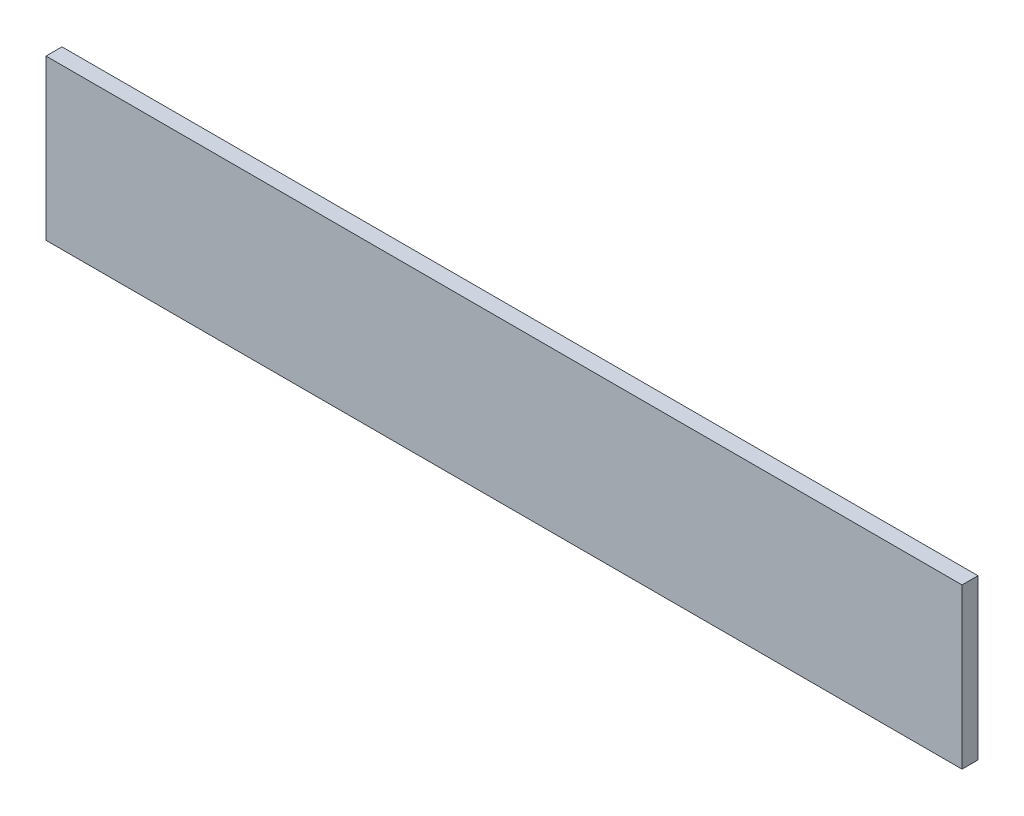
ISO-10303-21;
HEADER;
FILE_DESCRIPTION(('STEP AP214'),'2;1');
FILE_NAME('part.step','',(''),(''),'','','');
FILE_SCHEMA(('AUTOMOTIVE_DESIGN { 1 0 10303 214 1 1 1 1 }'));
ENDSEC;
DATA;
#1=APPLICATION_CONTEXT('core data for automotive mechanical design processes');
#2=APPLICATION_PROTOCOL_DEFINITION('international standard','automotive_design',2000,#1);
#3=PRODUCT_CONTEXT('',#1,'mechanical');
#4=PRODUCT('Part','Part','',(#3));
#5=PRODUCT_RELATED_PRODUCT_CATEGORY('part','',(#4));
#6=PRODUCT_DEFINITION_FORMATION('','',#4);
#7=PRODUCT_DEFINITION_CONTEXT('part definition',#1,'design');
#8=PRODUCT_DEFINITION('design','',#6,#7);
#9=PRODUCT_DEFINITION_SHAPE('','',#8);
#10=(LENGTH_UNIT() NAMED_UNIT(*) SI_UNIT(.MILLI.,.METRE.));
#11=(NAMED_UNIT(*) PLANE_ANGLE_UNIT() SI_UNIT($,.RADIAN.));
#12=(NAMED_UNIT(*) SI_UNIT($,.STERADIAN.) SOLID_ANGLE_UNIT());
#13=UNCERTAINTY_MEASURE_WITH_UNIT(LENGTH_MEASURE(1.E-05),#10,'distance_accuracy_value','');
#14=(GEOMETRIC_REPRESENTATION_CONTEXT(3) GLOBAL_UNCERTAINTY_ASSIGNED_CONTEXT((#13)) GLOBAL_UNIT_ASSIGNED_CONTEXT((#10,
#11,#12)) REPRESENTATION_CONTEXT('',''));
#15=CARTESIAN_POINT('',(0.,0.,0.));
#16=DIRECTION('',(0.,0.,1.));
#17=DIRECTION('',(1.,0.,0.));
#18=AXIS2_PLACEMENT_3D('',#15,#16,#17);
#19=CARTESIAN_POINT('',(-287.,50.,10.));
#20=DIRECTION('',(1.,0.,0.));
#21=DIRECTION('',(0.,0.,-1.));
#22=AXIS2_PLACEMENT_3D('',#19,#20,#21);
#23=PLANE('',#22);
#24=DIRECTION('',(0.,-1.,0.));
#25=VECTOR('',#24,1.);
#26=CARTESIAN_POINT('',(-287.,50.,0.));
#27=LINE('',#26,#25);
#28=CARTESIAN_POINT('',(-287.,50.,0.));
#29=VERTEX_POINT('',#28);
#30=CARTESIAN_POINT('',(-287.,-50.,0.));
#31=VERTEX_POINT('',#30);
#32=EDGE_CURVE('E102',#29,#31,#27,.T.);
#33=ORIENTED_EDGE('',*,*,#32,.T.);
#34=DIRECTION('',(0.,0.,-1.));
#35=VECTOR('',#34,1.);
#36=CARTESIAN_POINT('',(-287.,-50.,10.));
#37=LINE('',#36,#35);
#38=CARTESIAN_POINT('',(-287.,-50.,10.));
#39=VERTEX_POINT('',#38);
#40=EDGE_CURVE('E11',#39,#31,#37,.T.);
#41=ORIENTED_EDGE('',*,*,#40,.F.);
#42=DIRECTION('',(0.,-1.,0.));
#43=VECTOR('',#42,1.);
#44=CARTESIAN_POINT('',(-287.,50.,10.));
#45=LINE('',#44,#43);
#46=CARTESIAN_POINT('',(-287.,50.,10.));
#47=VERTEX_POINT('',#46);
#48=EDGE_CURVE('E90',#47,#39,#45,.T.);
#49=ORIENTED_EDGE('',*,*,#48,.F.);
#50=DIRECTION('',(0.,0.,-1.));
#51=VECTOR('',#50,1.);
#52=CARTESIAN_POINT('',(-287.,50.,10.));
#53=LINE('',#52,#51);
#54=EDGE_CURVE('E98',#47,#29,#53,.T.);
#55=ORIENTED_EDGE('',*,*,#54,.T.);
#56=EDGE_LOOP('',(#33,#41,#49,#55));
#57=FACE_BOUND('',#56,.T.);
#58=ADVANCED_FACE('F39',(#57),#23,.F.);
#59=CARTESIAN_POINT('',(-287.,-50.,10.));
#60=DIRECTION('',(0.,1.,0.));
#61=DIRECTION('',(-1.,0.,0.));
#62=AXIS2_PLACEMENT_3D('',#59,#60,#61);
#63=PLANE('',#62);
#64=DIRECTION('',(1.,0.,0.));
#65=VECTOR('',#64,1.);
#66=CARTESIAN_POINT('',(-287.,-50.,0.));
#67=LINE('',#66,#65);
#68=CARTESIAN_POINT('',(287.,-50.,0.));
#69=VERTEX_POINT('',#68);
#70=EDGE_CURVE('E94',#31,#69,#67,.T.);
#71=ORIENTED_EDGE('',*,*,#70,.T.);
#72=DIRECTION('',(0.,0.,-1.));
#73=VECTOR('',#72,1.);
#74=CARTESIAN_POINT('',(287.,-50.,10.));
#75=LINE('',#74,#73);
#76=CARTESIAN_POINT('',(287.,-50.,10.));
#77=VERTEX_POINT('',#76);
#78=EDGE_CURVE('E47',#77,#69,#75,.T.);
#79=ORIENTED_EDGE('',*,*,#78,.F.);
#80=DIRECTION('',(1.,0.,0.));
#81=VECTOR('',#80,1.);
#82=CARTESIAN_POINT('',(-287.,-50.,10.));
#83=LINE('',#82,#81);
#84=EDGE_CURVE('E85',#39,#77,#83,.T.);
#85=ORIENTED_EDGE('',*,*,#84,.F.);
#86=ORIENTED_EDGE('',*,*,#40,.T.);
#87=EDGE_LOOP('',(#71,#79,#85,#86));
#88=FACE_BOUND('',#87,.T.);
#89=ADVANCED_FACE('F93',(#88),#63,.F.);
#90=CARTESIAN_POINT('',(287.,50.,10.));
#91=DIRECTION('',(-1.,0.,0.));
#92=DIRECTION('',(0.,-1.,0.));
#93=AXIS2_PLACEMENT_3D('',#90,#91,#92);
#94=PLANE('',#93);
#95=DIRECTION('',(0.,1.,0.));
#96=VECTOR('',#95,1.);
#97=CARTESIAN_POINT('',(287.,50.,0.));
#98=LINE('',#97,#96);
#99=CARTESIAN_POINT('',(287.,50.,0.));
#100=VERTEX_POINT('',#99);
#101=EDGE_CURVE('E72',#69,#100,#98,.T.);
#102=ORIENTED_EDGE('',*,*,#101,.T.);
#103=DIRECTION('',(0.,0.,-1.));
#104=VECTOR('',#103,1.);
#105=CARTESIAN_POINT('',(287.,50.,10.));
#106=LINE('',#105,#104);
#107=CARTESIAN_POINT('',(287.,50.,10.));
#108=VERTEX_POINT('',#107);
#109=EDGE_CURVE('E95',#108,#100,#106,.T.);
#110=ORIENTED_EDGE('',*,*,#109,.F.);
#111=DIRECTION('',(0.,1.,0.));
#112=VECTOR('',#111,1.);
#113=CARTESIAN_POINT('',(287.,50.,10.));
#114=LINE('',#113,#112);
#115=EDGE_CURVE('E88',#77,#108,#114,.T.);
#116=ORIENTED_EDGE('',*,*,#115,.F.);
#117=ORIENTED_EDGE('',*,*,#78,.T.);
#118=EDGE_LOOP('',(#102,#110,#116,#117));
#119=FACE_BOUND('',#118,.T.);
#120=ADVANCED_FACE('F96',(#119),#94,.F.);
#121=CARTESIAN_POINT('',(-287.,50.,10.));
#122=DIRECTION('',(0.,-1.,0.));
#123=DIRECTION('',(0.,0.,-1.));
#124=AXIS2_PLACEMENT_3D('',#121,#122,#123);
#125=PLANE('',#124);
#126=DIRECTION('',(-1.,0.,0.));
#127=VECTOR('',#126,1.);
#128=CARTESIAN_POINT('',(-287.,50.,0.));
#129=LINE('',#128,#127);
#130=EDGE_CURVE('E78',#100,#29,#129,.T.);
#131=ORIENTED_EDGE('',*,*,#130,.T.);
#132=ORIENTED_EDGE('',*,*,#54,.F.);
#133=DIRECTION('',(-1.,0.,0.));
#134=VECTOR('',#133,1.);
#135=CARTESIAN_POINT('',(-287.,50.,10.));
#136=LINE('',#135,#134);
#137=EDGE_CURVE('E55',#108,#47,#136,.T.);
#138=ORIENTED_EDGE('',*,*,#137,.F.);
#139=ORIENTED_EDGE('',*,*,#109,.T.);
#140=EDGE_LOOP('',(#131,#132,#138,#139));
#141=FACE_BOUND('',#140,.T.);
#142=ADVANCED_FACE('F109',(#141),#125,.F.);
#143=CARTESIAN_POINT('',(0.,0.,10.));
#144=DIRECTION('',(0.,0.,1.));
#145=DIRECTION('',(1.,0.,0.));
#146=AXIS2_PLACEMENT_3D('',#143,#144,#145);
#147=PLANE('',#146);
#148=ORIENTED_EDGE('',*,*,#48,.T.);
#149=ORIENTED_EDGE('',*,*,#84,.T.);
#150=ORIENTED_EDGE('',*,*,#115,.T.);
#151=ORIENTED_EDGE('',*,*,#137,.T.);
#152=EDGE_LOOP('',(#148,#149,#150,#151));
#153=FACE_BOUND('',#152,.T.);
#154=ADVANCED_FACE('F86',(#153),#147,.T.);
#155=CARTESIAN_POINT('',(0.,0.,0.));
#156=DIRECTION('',(0.,0.,1.));
#157=DIRECTION('',(1.,0.,0.));
#158=AXIS2_PLACEMENT_3D('',#155,#156,#157);
#159=PLANE('',#158);
#160=ORIENTED_EDGE('',*,*,#32,.F.);
#161=ORIENTED_EDGE('',*,*,#130,.F.);
#162=ORIENTED_EDGE('',*,*,#101,.F.);
#163=ORIENTED_EDGE('',*,*,#70,.F.);
#164=EDGE_LOOP('',(#160,#161,#162,#163));
#165=FACE_BOUND('',#164,.T.);
#166=ADVANCED_FACE('F112',(#165),#159,.F.);
#167=CLOSED_SHELL('',(#58,#89,#120,#142,#154,#166));
#168=MANIFOLD_SOLID_BREP('B2',#167);
#169=ADVANCED_BREP_SHAPE_REPRESENTATION('',(#18,#168),#14);
#170=SHAPE_DEFINITION_REPRESENTATION(#9,#169);
ENDSEC;
END-ISO-10303-21;
